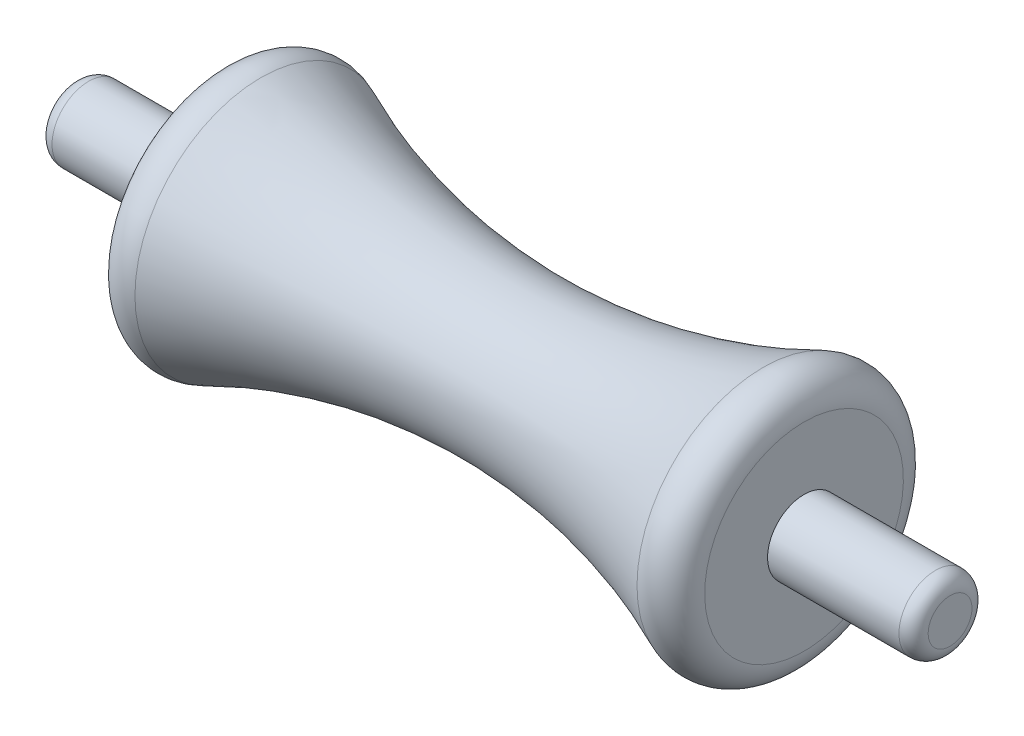
ISO-10303-21;
HEADER;
FILE_DESCRIPTION(('STEP AP214'),'2;1');
FILE_NAME('part.step','',(''),(''),'','','');
FILE_SCHEMA(('AUTOMOTIVE_DESIGN { 1 0 10303 214 1 1 1 1 }'));
ENDSEC;
DATA;
#1=APPLICATION_CONTEXT('core data for automotive mechanical design processes');
#2=APPLICATION_PROTOCOL_DEFINITION('international standard','automotive_design',2000,#1);
#3=PRODUCT_CONTEXT('',#1,'mechanical');
#4=PRODUCT('Part','Part','',(#3));
#5=PRODUCT_RELATED_PRODUCT_CATEGORY('part','',(#4));
#6=PRODUCT_DEFINITION_FORMATION('','',#4);
#7=PRODUCT_DEFINITION_CONTEXT('part definition',#1,'design');
#8=PRODUCT_DEFINITION('design','',#6,#7);
#9=PRODUCT_DEFINITION_SHAPE('','',#8);
#10=(LENGTH_UNIT() NAMED_UNIT(*) SI_UNIT(.MILLI.,.METRE.));
#11=(NAMED_UNIT(*) PLANE_ANGLE_UNIT() SI_UNIT($,.RADIAN.));
#12=(NAMED_UNIT(*) SI_UNIT($,.STERADIAN.) SOLID_ANGLE_UNIT());
#13=UNCERTAINTY_MEASURE_WITH_UNIT(LENGTH_MEASURE(1.E-05),#10,'distance_accuracy_value','');
#14=(GEOMETRIC_REPRESENTATION_CONTEXT(3) GLOBAL_UNCERTAINTY_ASSIGNED_CONTEXT((#13)) GLOBAL_UNIT_ASSIGNED_CONTEXT((#10,
#11,#12)) REPRESENTATION_CONTEXT('',''));
#15=CARTESIAN_POINT('',(0.,0.,0.));
#16=DIRECTION('',(0.,0.,1.));
#17=DIRECTION('',(1.,0.,0.));
#18=AXIS2_PLACEMENT_3D('',#15,#16,#17);
#19=CARTESIAN_POINT('',(-40.,-5.00000000000002,0.));
#20=DIRECTION('',(1.,0.,0.));
#21=DIRECTION('',(0.,1.,0.));
#22=AXIS2_PLACEMENT_3D('',#19,#20,#21);
#23=PLANE('',#22);
#24=CARTESIAN_POINT('',(-40.,0.,0.));
#25=DIRECTION('',(1.,0.,0.));
#26=DIRECTION('',(0.,1.,0.));
#27=AXIS2_PLACEMENT_3D('',#24,#25,#26);
#28=CIRCLE('',#27,13.6058970195014);
#29=CARTESIAN_POINT('',(-40.,13.6058970195014,0.));
#30=VERTEX_POINT('',#29);
#31=EDGE_CURVE('E10',#30,#30,#28,.T.);
#32=ORIENTED_EDGE('',*,*,#31,.F.);
#33=EDGE_LOOP('',(#32));
#34=FACE_BOUND('',#33,.T.);
#35=CARTESIAN_POINT('',(-40.,0.,0.));
#36=DIRECTION('',(1.,0.,0.));
#37=DIRECTION('',(0.,1.,0.));
#38=AXIS2_PLACEMENT_3D('',#35,#36,#37);
#39=CIRCLE('',#38,5.00000000000001);
#40=CARTESIAN_POINT('',(-40.,5.,0.));
#41=VERTEX_POINT('',#40);
#42=EDGE_CURVE('E71',#41,#41,#39,.T.);
#43=ORIENTED_EDGE('',*,*,#42,.T.);
#44=EDGE_LOOP('',(#43));
#45=FACE_BOUND('',#44,.T.);
#46=ADVANCED_FACE('F37',(#34,#45),#23,.F.);
#47=CARTESIAN_POINT('',(-36.,0.,0.));
#48=DIRECTION('',(1.,0.,0.));
#49=DIRECTION('',(0.,1.,0.));
#50=AXIS2_PLACEMENT_3D('',#47,#48,#49);
#51=TOROIDAL_SURFACE('',#50,13.6058970195014,4.00000000000001);
#52=CARTESIAN_POINT('',(-34.3820224719101,0.,0.));
#53=DIRECTION('',(1.,0.,0.));
#54=DIRECTION('',(0.,1.,0.));
#55=AXIS2_PLACEMENT_3D('',#52,#53,#54);
#56=CIRCLE('',#55,17.2640589512093);
#57=CARTESIAN_POINT('',(-34.3820224719101,17.2640589512093,0.));
#58=VERTEX_POINT('',#57);
#59=EDGE_CURVE('E43',#58,#58,#56,.T.);
#60=ORIENTED_EDGE('',*,*,#59,.F.);
#61=EDGE_LOOP('',(#60));
#62=FACE_BOUND('',#61,.T.);
#63=ORIENTED_EDGE('',*,*,#31,.T.);
#64=EDGE_LOOP('',(#63));
#65=FACE_BOUND('',#64,.T.);
#66=ADVANCED_FACE('F99',(#62,#65),#51,.T.);
#67=CARTESIAN_POINT('',(0.,0.,0.));
#68=DIRECTION('',(1.,0.,0.));
#69=DIRECTION('',(0.,1.,0.));
#70=AXIS2_PLACEMENT_3D('',#67,#68,#69);
#71=TOROIDAL_SURFACE('',#70,94.9999999999999,84.9999999999999);
#72=CARTESIAN_POINT('',(34.3820224719101,0.,0.));
#73=DIRECTION('',(1.,0.,0.));
#74=DIRECTION('',(0.,1.,0.));
#75=AXIS2_PLACEMENT_3D('',#72,#73,#74);
#76=CIRCLE('',#75,17.2640589512093);
#77=CARTESIAN_POINT('',(34.3820224719101,17.2640589512093,0.));
#78=VERTEX_POINT('',#77);
#79=EDGE_CURVE('E47',#78,#78,#76,.T.);
#80=ORIENTED_EDGE('',*,*,#79,.F.);
#81=EDGE_LOOP('',(#80));
#82=FACE_BOUND('',#81,.T.);
#83=ORIENTED_EDGE('',*,*,#59,.T.);
#84=EDGE_LOOP('',(#83));
#85=FACE_BOUND('',#84,.T.);
#86=ADVANCED_FACE('F104',(#82,#85),#71,.F.);
#87=CARTESIAN_POINT('',(36.,0.,0.));
#88=DIRECTION('',(1.,0.,0.));
#89=DIRECTION('',(0.,1.,0.));
#90=AXIS2_PLACEMENT_3D('',#87,#88,#89);
#91=TOROIDAL_SURFACE('',#90,13.6058970195015,4.);
#92=CARTESIAN_POINT('',(40.,0.,0.));
#93=DIRECTION('',(1.,0.,0.));
#94=DIRECTION('',(0.,1.,0.));
#95=AXIS2_PLACEMENT_3D('',#92,#93,#94);
#96=CIRCLE('',#95,13.6058970195015);
#97=CARTESIAN_POINT('',(40.,13.6058970195015,0.));
#98=VERTEX_POINT('',#97);
#99=EDGE_CURVE('E51',#98,#98,#96,.T.);
#100=ORIENTED_EDGE('',*,*,#99,.F.);
#101=EDGE_LOOP('',(#100));
#102=FACE_BOUND('',#101,.T.);
#103=ORIENTED_EDGE('',*,*,#79,.T.);
#104=EDGE_LOOP('',(#103));
#105=FACE_BOUND('',#104,.T.);
#106=ADVANCED_FACE('F109',(#102,#105),#91,.T.);
#107=CARTESIAN_POINT('',(40.,-5.,0.));
#108=DIRECTION('',(-1.,0.,0.));
#109=DIRECTION('',(0.,-1.,0.));
#110=AXIS2_PLACEMENT_3D('',#107,#108,#109);
#111=PLANE('',#110);
#112=CARTESIAN_POINT('',(40.,0.,0.));
#113=DIRECTION('',(1.,0.,0.));
#114=DIRECTION('',(0.,1.,0.));
#115=AXIS2_PLACEMENT_3D('',#112,#113,#114);
#116=CIRCLE('',#115,5.00000000000002);
#117=CARTESIAN_POINT('',(40.,5.00000000000003,0.));
#118=VERTEX_POINT('',#117);
#119=EDGE_CURVE('E56',#118,#118,#116,.T.);
#120=ORIENTED_EDGE('',*,*,#119,.F.);
#121=EDGE_LOOP('',(#120));
#122=FACE_BOUND('',#121,.T.);
#123=ORIENTED_EDGE('',*,*,#99,.T.);
#124=EDGE_LOOP('',(#123));
#125=FACE_BOUND('',#124,.T.);
#126=ADVANCED_FACE('F115',(#122,#125),#111,.F.);
#127=CARTESIAN_POINT('',(60.,0.,0.));
#128=DIRECTION('',(1.,0.,0.));
#129=DIRECTION('',(0.,1.,0.));
#130=AXIS2_PLACEMENT_3D('',#127,#128,#129);
#131=CYLINDRICAL_SURFACE('',#130,5.00000000000002);
#132=CARTESIAN_POINT('',(58.,0.,0.));
#133=DIRECTION('',(1.,0.,0.));
#134=DIRECTION('',(0.,1.,0.));
#135=AXIS2_PLACEMENT_3D('',#132,#133,#134);
#136=CIRCLE('',#135,5.00000000000002);
#137=CARTESIAN_POINT('',(58.,5.00000000000004,0.));
#138=VERTEX_POINT('',#137);
#139=EDGE_CURVE('E59',#138,#138,#136,.T.);
#140=ORIENTED_EDGE('',*,*,#139,.F.);
#141=EDGE_LOOP('',(#140));
#142=FACE_BOUND('',#141,.T.);
#143=ORIENTED_EDGE('',*,*,#119,.T.);
#144=EDGE_LOOP('',(#143));
#145=FACE_BOUND('',#144,.T.);
#146=ADVANCED_FACE('F119',(#142,#145),#131,.T.);
#147=CARTESIAN_POINT('',(58.,0.,0.));
#148=DIRECTION('',(1.,0.,0.));
#149=DIRECTION('',(0.,1.,0.));
#150=AXIS2_PLACEMENT_3D('',#147,#148,#149);
#151=TOROIDAL_SURFACE('',#150,3.00000000000002,2.);
#152=CARTESIAN_POINT('',(60.,0.,0.));
#153=DIRECTION('',(1.,0.,0.));
#154=DIRECTION('',(0.,1.,0.));
#155=AXIS2_PLACEMENT_3D('',#152,#153,#154);
#156=CIRCLE('',#155,3.00000000000001);
#157=CARTESIAN_POINT('',(60.,3.00000000000003,0.));
#158=VERTEX_POINT('',#157);
#159=EDGE_CURVE('E62',#158,#158,#156,.T.);
#160=ORIENTED_EDGE('',*,*,#159,.F.);
#161=EDGE_LOOP('',(#160));
#162=FACE_BOUND('',#161,.T.);
#163=ORIENTED_EDGE('',*,*,#139,.T.);
#164=EDGE_LOOP('',(#163));
#165=FACE_BOUND('',#164,.T.);
#166=ADVANCED_FACE('F95',(#162,#165),#151,.T.);
#167=CARTESIAN_POINT('',(60.,0.,0.));
#168=DIRECTION('',(-1.,0.,0.));
#169=DIRECTION('',(0.,-1.,0.));
#170=AXIS2_PLACEMENT_3D('',#167,#168,#169);
#171=PLANE('',#170);
#172=ORIENTED_EDGE('',*,*,#159,.T.);
#173=EDGE_LOOP('',(#172));
#174=FACE_BOUND('',#173,.T.);
#175=ADVANCED_FACE('F90',(#174),#171,.F.);
#176=CARTESIAN_POINT('',(-60.,0.,0.));
#177=DIRECTION('',(1.,0.,0.));
#178=DIRECTION('',(0.,1.,0.));
#179=AXIS2_PLACEMENT_3D('',#176,#177,#178);
#180=PLANE('',#179);
#181=CARTESIAN_POINT('',(-60.,0.,0.));
#182=DIRECTION('',(1.,0.,0.));
#183=DIRECTION('',(0.,1.,0.));
#184=AXIS2_PLACEMENT_3D('',#181,#182,#183);
#185=CIRCLE('',#184,2.99999999999998);
#186=CARTESIAN_POINT('',(-60.,2.99999999999997,0.));
#187=VERTEX_POINT('',#186);
#188=EDGE_CURVE('E65',#187,#187,#185,.T.);
#189=ORIENTED_EDGE('',*,*,#188,.F.);
#190=EDGE_LOOP('',(#189));
#191=FACE_BOUND('',#190,.T.);
#192=ADVANCED_FACE('F85',(#191),#180,.F.);
#193=CARTESIAN_POINT('',(-58.,0.,0.));
#194=DIRECTION('',(1.,0.,0.));
#195=DIRECTION('',(0.,1.,0.));
#196=AXIS2_PLACEMENT_3D('',#193,#194,#195);
#197=TOROIDAL_SURFACE('',#196,3.,2.);
#198=CARTESIAN_POINT('',(-58.,0.,0.));
#199=DIRECTION('',(1.,0.,0.));
#200=DIRECTION('',(0.,1.,0.));
#201=AXIS2_PLACEMENT_3D('',#198,#199,#200);
#202=CIRCLE('',#201,5.);
#203=CARTESIAN_POINT('',(-58.,4.99999999999998,0.));
#204=VERTEX_POINT('',#203);
#205=EDGE_CURVE('E68',#204,#204,#202,.T.);
#206=ORIENTED_EDGE('',*,*,#205,.F.);
#207=EDGE_LOOP('',(#206));
#208=FACE_BOUND('',#207,.T.);
#209=ORIENTED_EDGE('',*,*,#188,.T.);
#210=EDGE_LOOP('',(#209));
#211=FACE_BOUND('',#210,.T.);
#212=ADVANCED_FACE('F79',(#208,#211),#197,.T.);
#213=CARTESIAN_POINT('',(60.,0.,0.));
#214=DIRECTION('',(1.,0.,0.));
#215=DIRECTION('',(0.,1.,0.));
#216=AXIS2_PLACEMENT_3D('',#213,#214,#215);
#217=CYLINDRICAL_SURFACE('',#216,5.);
#218=ORIENTED_EDGE('',*,*,#42,.F.);
#219=EDGE_LOOP('',(#218));
#220=FACE_BOUND('',#219,.T.);
#221=ORIENTED_EDGE('',*,*,#205,.T.);
#222=EDGE_LOOP('',(#221));
#223=FACE_BOUND('',#222,.T.);
#224=ADVANCED_FACE('F76',(#220,#223),#217,.T.);
#225=CLOSED_SHELL('',(#46,#66,#86,#106,#126,#146,#166,#175,#192,#212,#224));
#226=MANIFOLD_SOLID_BREP('B2',#225);
#227=ADVANCED_BREP_SHAPE_REPRESENTATION('',(#18,#226),#14);
#228=SHAPE_DEFINITION_REPRESENTATION(#9,#227);
ENDSEC;
END-ISO-10303-21;
